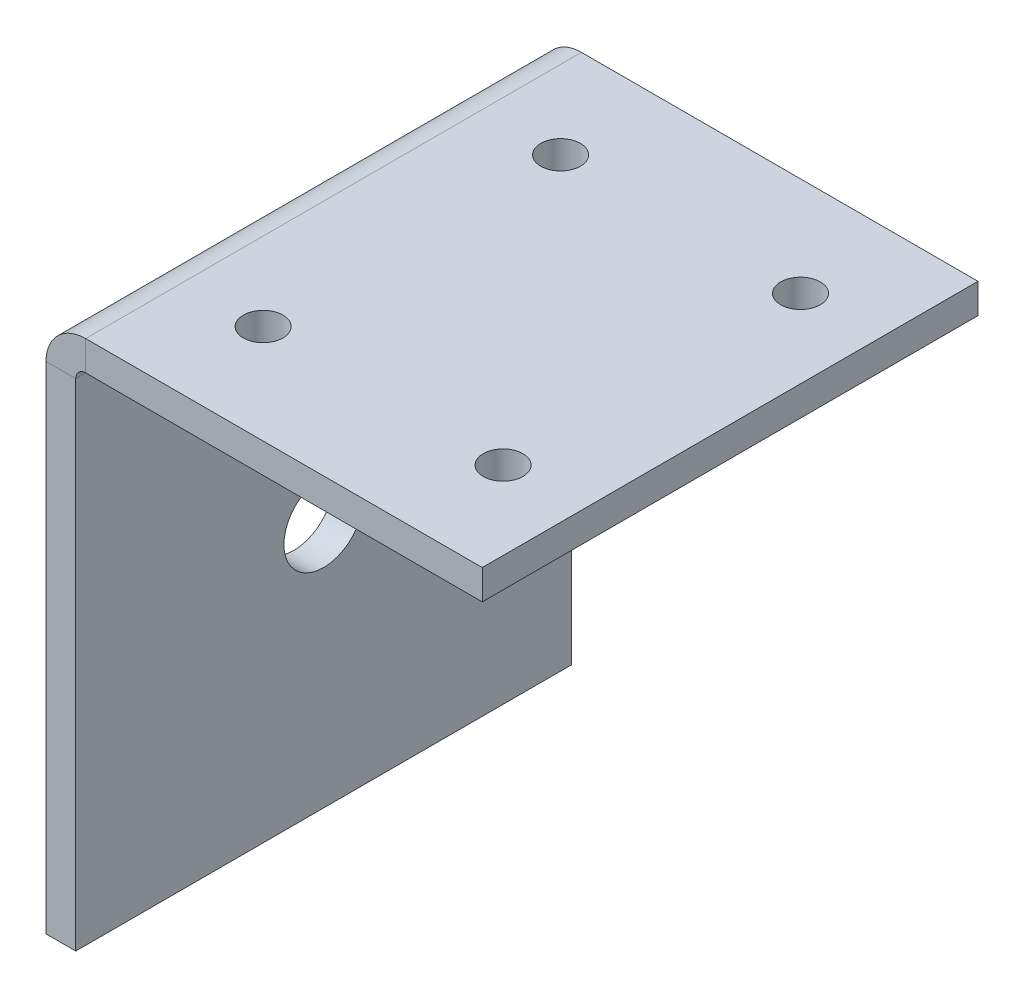
ISO-10303-21;
HEADER;
FILE_DESCRIPTION(('STEP AP214'),'2;1');
FILE_NAME('part.step','',(''),(''),'','','');
FILE_SCHEMA(('AUTOMOTIVE_DESIGN { 1 0 10303 214 1 1 1 1 }'));
ENDSEC;
DATA;
#1=APPLICATION_CONTEXT('core data for automotive mechanical design processes');
#2=APPLICATION_PROTOCOL_DEFINITION('international standard','automotive_design',2000,#1);
#3=PRODUCT_CONTEXT('',#1,'mechanical');
#4=PRODUCT('Part','Part','',(#3));
#5=PRODUCT_RELATED_PRODUCT_CATEGORY('part','',(#4));
#6=PRODUCT_DEFINITION_FORMATION('','',#4);
#7=PRODUCT_DEFINITION_CONTEXT('part definition',#1,'design');
#8=PRODUCT_DEFINITION('design','',#6,#7);
#9=PRODUCT_DEFINITION_SHAPE('','',#8);
#10=(LENGTH_UNIT() NAMED_UNIT(*) SI_UNIT(.MILLI.,.METRE.));
#11=(NAMED_UNIT(*) PLANE_ANGLE_UNIT() SI_UNIT($,.RADIAN.));
#12=(NAMED_UNIT(*) SI_UNIT($,.STERADIAN.) SOLID_ANGLE_UNIT());
#13=UNCERTAINTY_MEASURE_WITH_UNIT(LENGTH_MEASURE(1.E-05),#10,'distance_accuracy_value','');
#14=(GEOMETRIC_REPRESENTATION_CONTEXT(3) GLOBAL_UNCERTAINTY_ASSIGNED_CONTEXT((#13)) GLOBAL_UNIT_ASSIGNED_CONTEXT((#10,
#11,#12)) REPRESENTATION_CONTEXT('',''));
#15=CARTESIAN_POINT('',(0.,0.,0.));
#16=DIRECTION('',(0.,0.,1.));
#17=DIRECTION('',(1.,0.,0.));
#18=AXIS2_PLACEMENT_3D('',#15,#16,#17);
#19=CARTESIAN_POINT('',(-20.,-3.,-25.));
#20=DIRECTION('',(0.,0.,-1.));
#21=DIRECTION('',(-1.,0.,0.));
#22=AXIS2_PLACEMENT_3D('',#19,#20,#21);
#23=PLANE('',#22);
#24=DIRECTION('',(-1.,0.,0.));
#25=VECTOR('',#24,1.);
#26=CARTESIAN_POINT('',(-20.,0.,-25.));
#27=LINE('',#26,#25);
#28=CARTESIAN_POINT('',(20.,0.,-25.));
#29=VERTEX_POINT('',#28);
#30=CARTESIAN_POINT('',(-20.,0.,-25.));
#31=VERTEX_POINT('',#30);
#32=EDGE_CURVE('E108',#29,#31,#27,.T.);
#33=ORIENTED_EDGE('',*,*,#32,.F.);
#34=DIRECTION('',(0.,1.,0.));
#35=VECTOR('',#34,1.);
#36=CARTESIAN_POINT('',(20.,-3.,-25.));
#37=LINE('',#36,#35);
#38=CARTESIAN_POINT('',(20.,-3.,-25.));
#39=VERTEX_POINT('',#38);
#40=EDGE_CURVE('E71',#39,#29,#37,.T.);
#41=ORIENTED_EDGE('',*,*,#40,.F.);
#42=DIRECTION('',(-1.,0.,0.));
#43=VECTOR('',#42,1.);
#44=CARTESIAN_POINT('',(-20.,-3.,-25.));
#45=LINE('',#44,#43);
#46=CARTESIAN_POINT('',(-20.,-3.,-25.));
#47=VERTEX_POINT('',#46);
#48=EDGE_CURVE('E121',#39,#47,#45,.T.);
#49=ORIENTED_EDGE('',*,*,#48,.T.);
#50=DIRECTION('',(0.,1.,0.));
#51=VECTOR('',#50,1.);
#52=CARTESIAN_POINT('',(-20.,-3.,-25.));
#53=LINE('',#52,#51);
#54=EDGE_CURVE('E13',#47,#31,#53,.T.);
#55=ORIENTED_EDGE('',*,*,#54,.T.);
#56=EDGE_LOOP('',(#33,#41,#49,#55));
#57=FACE_BOUND('',#56,.T.);
#58=ADVANCED_FACE('F61',(#57),#23,.T.);
#59=CARTESIAN_POINT('',(20.,-3.,25.));
#60=DIRECTION('',(1.,0.,0.));
#61=DIRECTION('',(0.,0.,-1.));
#62=AXIS2_PLACEMENT_3D('',#59,#60,#61);
#63=PLANE('',#62);
#64=DIRECTION('',(0.,0.,-1.));
#65=VECTOR('',#64,1.);
#66=CARTESIAN_POINT('',(20.,0.,25.));
#67=LINE('',#66,#65);
#68=CARTESIAN_POINT('',(20.,0.,25.));
#69=VERTEX_POINT('',#68);
#70=EDGE_CURVE('E98',#69,#29,#67,.T.);
#71=ORIENTED_EDGE('',*,*,#70,.F.);
#72=DIRECTION('',(0.,1.,0.));
#73=VECTOR('',#72,1.);
#74=CARTESIAN_POINT('',(20.,-3.,25.));
#75=LINE('',#74,#73);
#76=CARTESIAN_POINT('',(20.,-3.,25.));
#77=VERTEX_POINT('',#76);
#78=EDGE_CURVE('E93',#77,#69,#75,.T.);
#79=ORIENTED_EDGE('',*,*,#78,.F.);
#80=DIRECTION('',(0.,0.,-1.));
#81=VECTOR('',#80,1.);
#82=CARTESIAN_POINT('',(20.,-3.,25.));
#83=LINE('',#82,#81);
#84=EDGE_CURVE('E101',#77,#39,#83,.T.);
#85=ORIENTED_EDGE('',*,*,#84,.T.);
#86=ORIENTED_EDGE('',*,*,#40,.T.);
#87=EDGE_LOOP('',(#71,#79,#85,#86));
#88=FACE_BOUND('',#87,.T.);
#89=ADVANCED_FACE('F97',(#88),#63,.T.);
#90=CARTESIAN_POINT('',(-20.,-3.,25.));
#91=DIRECTION('',(0.,0.,1.));
#92=DIRECTION('',(1.,0.,0.));
#93=AXIS2_PLACEMENT_3D('',#90,#91,#92);
#94=PLANE('',#93);
#95=DIRECTION('',(1.,0.,0.));
#96=VECTOR('',#95,1.);
#97=CARTESIAN_POINT('',(-20.,0.,25.));
#98=LINE('',#97,#96);
#99=CARTESIAN_POINT('',(-20.,0.,25.));
#100=VERTEX_POINT('',#99);
#101=EDGE_CURVE('E109',#100,#69,#98,.T.);
#102=ORIENTED_EDGE('',*,*,#101,.F.);
#103=DIRECTION('',(0.,1.,0.));
#104=VECTOR('',#103,1.);
#105=CARTESIAN_POINT('',(-20.,-3.,25.));
#106=LINE('',#105,#104);
#107=CARTESIAN_POINT('',(-20.,-3.,25.));
#108=VERTEX_POINT('',#107);
#109=EDGE_CURVE('E119',#108,#100,#106,.T.);
#110=ORIENTED_EDGE('',*,*,#109,.F.);
#111=DIRECTION('',(1.,0.,0.));
#112=VECTOR('',#111,1.);
#113=CARTESIAN_POINT('',(-20.,-3.,25.));
#114=LINE('',#113,#112);
#115=EDGE_CURVE('E115',#108,#77,#114,.T.);
#116=ORIENTED_EDGE('',*,*,#115,.T.);
#117=ORIENTED_EDGE('',*,*,#78,.T.);
#118=EDGE_LOOP('',(#102,#110,#116,#117));
#119=FACE_BOUND('',#118,.T.);
#120=ADVANCED_FACE('F63',(#119),#94,.T.);
#121=CARTESIAN_POINT('',(0.,-3.,0.));
#122=DIRECTION('',(0.,-1.,0.));
#123=DIRECTION('',(0.,0.,-1.));
#124=AXIS2_PLACEMENT_3D('',#121,#122,#123);
#125=PLANE('',#124);
#126=CARTESIAN_POINT('',(12.1,-3.,15.));
#127=DIRECTION('',(0.,1.,0.));
#128=DIRECTION('',(0.,0.,1.));
#129=AXIS2_PLACEMENT_3D('',#126,#127,#128);
#130=CIRCLE('',#129,2.);
#131=CARTESIAN_POINT('',(12.1,-3.,17.));
#132=VERTEX_POINT('',#131);
#133=EDGE_CURVE('E217',#132,#132,#130,.T.);
#134=ORIENTED_EDGE('',*,*,#133,.T.);
#135=EDGE_LOOP('',(#134));
#136=FACE_BOUND('',#135,.T.);
#137=CARTESIAN_POINT('',(-12.1,-3.,-15.));
#138=DIRECTION('',(0.,1.,0.));
#139=DIRECTION('',(0.,0.,1.));
#140=AXIS2_PLACEMENT_3D('',#137,#138,#139);
#141=CIRCLE('',#140,2.);
#142=CARTESIAN_POINT('',(-12.1,-3.,-13.));
#143=VERTEX_POINT('',#142);
#144=EDGE_CURVE('E223',#143,#143,#141,.T.);
#145=ORIENTED_EDGE('',*,*,#144,.T.);
#146=EDGE_LOOP('',(#145));
#147=FACE_BOUND('',#146,.T.);
#148=CARTESIAN_POINT('',(-12.1,-3.,15.));
#149=DIRECTION('',(0.,1.,0.));
#150=DIRECTION('',(0.,0.,1.));
#151=AXIS2_PLACEMENT_3D('',#148,#149,#150);
#152=CIRCLE('',#151,2.);
#153=CARTESIAN_POINT('',(-12.1,-3.,17.));
#154=VERTEX_POINT('',#153);
#155=EDGE_CURVE('E140',#154,#154,#152,.T.);
#156=ORIENTED_EDGE('',*,*,#155,.T.);
#157=EDGE_LOOP('',(#156));
#158=FACE_BOUND('',#157,.T.);
#159=CARTESIAN_POINT('',(12.1,-3.,-15.));
#160=DIRECTION('',(0.,1.,0.));
#161=DIRECTION('',(0.,0.,1.));
#162=AXIS2_PLACEMENT_3D('',#159,#160,#161);
#163=CIRCLE('',#162,2.);
#164=CARTESIAN_POINT('',(12.1,-3.,-13.));
#165=VERTEX_POINT('',#164);
#166=EDGE_CURVE('E132',#165,#165,#163,.T.);
#167=ORIENTED_EDGE('',*,*,#166,.T.);
#168=EDGE_LOOP('',(#167));
#169=FACE_BOUND('',#168,.T.);
#170=DIRECTION('',(0.,0.,1.));
#171=VECTOR('',#170,1.);
#172=CARTESIAN_POINT('',(-20.,-3.,25.));
#173=LINE('',#172,#171);
#174=EDGE_CURVE('E112',#47,#108,#173,.T.);
#175=ORIENTED_EDGE('',*,*,#174,.F.);
#176=ORIENTED_EDGE('',*,*,#48,.F.);
#177=ORIENTED_EDGE('',*,*,#84,.F.);
#178=ORIENTED_EDGE('',*,*,#115,.F.);
#179=EDGE_LOOP('',(#175,#176,#177,#178));
#180=FACE_BOUND('',#179,.T.);
#181=ADVANCED_FACE('F149',(#136,#147,#158,#169,#180),#125,.T.);
#182=CARTESIAN_POINT('',(0.,0.,0.));
#183=DIRECTION('',(0.,-1.,0.));
#184=DIRECTION('',(0.,0.,-1.));
#185=AXIS2_PLACEMENT_3D('',#182,#183,#184);
#186=PLANE('',#185);
#187=CARTESIAN_POINT('',(12.1,0.,15.));
#188=DIRECTION('',(0.,1.,0.));
#189=DIRECTION('',(0.,0.,1.));
#190=AXIS2_PLACEMENT_3D('',#187,#188,#189);
#191=CIRCLE('',#190,2.);
#192=CARTESIAN_POINT('',(12.1,0.,17.));
#193=VERTEX_POINT('',#192);
#194=EDGE_CURVE('E213',#193,#193,#191,.T.);
#195=ORIENTED_EDGE('',*,*,#194,.F.);
#196=EDGE_LOOP('',(#195));
#197=FACE_BOUND('',#196,.T.);
#198=CARTESIAN_POINT('',(-12.1,0.,-15.));
#199=DIRECTION('',(0.,1.,0.));
#200=DIRECTION('',(0.,0.,1.));
#201=AXIS2_PLACEMENT_3D('',#198,#199,#200);
#202=CIRCLE('',#201,2.);
#203=CARTESIAN_POINT('',(-12.1,0.,-13.));
#204=VERTEX_POINT('',#203);
#205=EDGE_CURVE('E220',#204,#204,#202,.T.);
#206=ORIENTED_EDGE('',*,*,#205,.F.);
#207=EDGE_LOOP('',(#206));
#208=FACE_BOUND('',#207,.T.);
#209=CARTESIAN_POINT('',(-12.1,0.,15.));
#210=DIRECTION('',(0.,1.,0.));
#211=DIRECTION('',(0.,0.,1.));
#212=AXIS2_PLACEMENT_3D('',#209,#210,#211);
#213=CIRCLE('',#212,2.);
#214=CARTESIAN_POINT('',(-12.1,0.,17.));
#215=VERTEX_POINT('',#214);
#216=EDGE_CURVE('E143',#215,#215,#213,.T.);
#217=ORIENTED_EDGE('',*,*,#216,.F.);
#218=EDGE_LOOP('',(#217));
#219=FACE_BOUND('',#218,.T.);
#220=CARTESIAN_POINT('',(12.1,0.,-15.));
#221=DIRECTION('',(0.,1.,0.));
#222=DIRECTION('',(0.,0.,1.));
#223=AXIS2_PLACEMENT_3D('',#220,#221,#222);
#224=CIRCLE('',#223,2.);
#225=CARTESIAN_POINT('',(12.1,0.,-13.));
#226=VERTEX_POINT('',#225);
#227=EDGE_CURVE('E135',#226,#226,#224,.T.);
#228=ORIENTED_EDGE('',*,*,#227,.F.);
#229=EDGE_LOOP('',(#228));
#230=FACE_BOUND('',#229,.T.);
#231=DIRECTION('',(0.,0.,1.));
#232=VECTOR('',#231,1.);
#233=CARTESIAN_POINT('',(-20.,0.,25.));
#234=LINE('',#233,#232);
#235=EDGE_CURVE('E131',#31,#100,#234,.T.);
#236=ORIENTED_EDGE('',*,*,#235,.T.);
#237=ORIENTED_EDGE('',*,*,#101,.T.);
#238=ORIENTED_EDGE('',*,*,#70,.T.);
#239=ORIENTED_EDGE('',*,*,#32,.T.);
#240=EDGE_LOOP('',(#236,#237,#238,#239));
#241=FACE_BOUND('',#240,.T.);
#242=ADVANCED_FACE('F107',(#197,#208,#219,#230,#241),#186,.F.);
#243=CARTESIAN_POINT('',(12.1,-3.,-15.));
#244=DIRECTION('',(0.,1.,0.));
#245=DIRECTION('',(0.,0.,1.));
#246=AXIS2_PLACEMENT_3D('',#243,#244,#245);
#247=CYLINDRICAL_SURFACE('',#246,2.);
#248=ORIENTED_EDGE('',*,*,#166,.F.);
#249=EDGE_LOOP('',(#248));
#250=FACE_BOUND('',#249,.T.);
#251=ORIENTED_EDGE('',*,*,#227,.T.);
#252=EDGE_LOOP('',(#251));
#253=FACE_BOUND('',#252,.T.);
#254=ADVANCED_FACE('F237',(#250,#253),#247,.F.);
#255=CARTESIAN_POINT('',(-12.1,-3.,15.));
#256=DIRECTION('',(0.,1.,0.));
#257=DIRECTION('',(0.,0.,1.));
#258=AXIS2_PLACEMENT_3D('',#255,#256,#257);
#259=CYLINDRICAL_SURFACE('',#258,2.);
#260=ORIENTED_EDGE('',*,*,#155,.F.);
#261=EDGE_LOOP('',(#260));
#262=FACE_BOUND('',#261,.T.);
#263=ORIENTED_EDGE('',*,*,#216,.T.);
#264=EDGE_LOOP('',(#263));
#265=FACE_BOUND('',#264,.T.);
#266=ADVANCED_FACE('F233',(#262,#265),#259,.F.);
#267=CARTESIAN_POINT('',(-12.1,-3.,-15.));
#268=DIRECTION('',(0.,1.,0.));
#269=DIRECTION('',(0.,0.,1.));
#270=AXIS2_PLACEMENT_3D('',#267,#268,#269);
#271=CYLINDRICAL_SURFACE('',#270,2.);
#272=ORIENTED_EDGE('',*,*,#144,.F.);
#273=EDGE_LOOP('',(#272));
#274=FACE_BOUND('',#273,.T.);
#275=ORIENTED_EDGE('',*,*,#205,.T.);
#276=EDGE_LOOP('',(#275));
#277=FACE_BOUND('',#276,.T.);
#278=ADVANCED_FACE('F248',(#274,#277),#271,.F.);
#279=CARTESIAN_POINT('',(12.1,-3.,15.));
#280=DIRECTION('',(0.,1.,0.));
#281=DIRECTION('',(0.,0.,1.));
#282=AXIS2_PLACEMENT_3D('',#279,#280,#281);
#283=CYLINDRICAL_SURFACE('',#282,2.);
#284=ORIENTED_EDGE('',*,*,#133,.F.);
#285=EDGE_LOOP('',(#284));
#286=FACE_BOUND('',#285,.T.);
#287=ORIENTED_EDGE('',*,*,#194,.T.);
#288=EDGE_LOOP('',(#287));
#289=FACE_BOUND('',#288,.T.);
#290=ADVANCED_FACE('F268',(#286,#289),#283,.F.);
#291=CARTESIAN_POINT('',(-20.,-4.,25.));
#292=DIRECTION('',(0.,0.,1.));
#293=DIRECTION('',(1.,0.,0.));
#294=AXIS2_PLACEMENT_3D('',#291,#292,#293);
#295=PLANE('',#294);
#296=DIRECTION('',(1.,0.,0.));
#297=VECTOR('',#296,1.);
#298=CARTESIAN_POINT('',(-24.,-3.99999999999999,25.));
#299=LINE('',#298,#297);
#300=CARTESIAN_POINT('',(-21.,-4.,25.));
#301=VERTEX_POINT('',#300);
#302=CARTESIAN_POINT('',(-24.,-3.99999999999999,25.));
#303=VERTEX_POINT('',#302);
#304=EDGE_CURVE('E176',#301,#303,#299,.F.);
#305=ORIENTED_EDGE('',*,*,#304,.F.);
#306=CARTESIAN_POINT('',(-20.,-4.,25.));
#307=DIRECTION('',(0.,0.,-1.));
#308=DIRECTION('',(-1.,0.,0.));
#309=AXIS2_PLACEMENT_3D('',#306,#307,#308);
#310=CIRCLE('',#309,1.);
#311=EDGE_CURVE('E170',#108,#301,#310,.F.);
#312=ORIENTED_EDGE('',*,*,#311,.F.);
#313=ORIENTED_EDGE('',*,*,#109,.T.);
#314=CARTESIAN_POINT('',(-20.,-4.,25.));
#315=DIRECTION('',(0.,0.,-1.));
#316=DIRECTION('',(-1.,0.,0.));
#317=AXIS2_PLACEMENT_3D('',#314,#315,#316);
#318=CIRCLE('',#317,4.);
#319=EDGE_CURVE('E211',#100,#303,#318,.F.);
#320=ORIENTED_EDGE('',*,*,#319,.T.);
#321=EDGE_LOOP('',(#305,#312,#313,#320));
#322=FACE_BOUND('',#321,.T.);
#323=ADVANCED_FACE('F275',(#322),#295,.T.);
#324=CARTESIAN_POINT('',(-20.,-4.,-25.));
#325=DIRECTION('',(0.,0.,1.));
#326=DIRECTION('',(1.,0.,0.));
#327=AXIS2_PLACEMENT_3D('',#324,#325,#326);
#328=PLANE('',#327);
#329=CARTESIAN_POINT('',(-20.,-4.,-25.));
#330=DIRECTION('',(0.,0.,-1.));
#331=DIRECTION('',(-1.,0.,0.));
#332=AXIS2_PLACEMENT_3D('',#329,#330,#331);
#333=CIRCLE('',#332,1.);
#334=CARTESIAN_POINT('',(-21.,-4.,-25.));
#335=VERTEX_POINT('',#334);
#336=EDGE_CURVE('E169',#335,#47,#333,.T.);
#337=ORIENTED_EDGE('',*,*,#336,.F.);
#338=DIRECTION('',(1.,0.,0.));
#339=VECTOR('',#338,1.);
#340=CARTESIAN_POINT('',(-21.,-4.,-25.));
#341=LINE('',#340,#339);
#342=CARTESIAN_POINT('',(-24.,-3.99999999999999,-25.));
#343=VERTEX_POINT('',#342);
#344=EDGE_CURVE('E175',#335,#343,#341,.F.);
#345=ORIENTED_EDGE('',*,*,#344,.T.);
#346=CARTESIAN_POINT('',(-20.,-4.,-25.));
#347=DIRECTION('',(0.,0.,-1.));
#348=DIRECTION('',(-1.,0.,0.));
#349=AXIS2_PLACEMENT_3D('',#346,#347,#348);
#350=CIRCLE('',#349,4.);
#351=EDGE_CURVE('E214',#343,#31,#350,.T.);
#352=ORIENTED_EDGE('',*,*,#351,.T.);
#353=ORIENTED_EDGE('',*,*,#54,.F.);
#354=EDGE_LOOP('',(#337,#345,#352,#353));
#355=FACE_BOUND('',#354,.T.);
#356=ADVANCED_FACE('F181',(#355),#328,.F.);
#357=CARTESIAN_POINT('',(-20.,-4.,-25.));
#358=DIRECTION('',(0.,0.,-1.));
#359=DIRECTION('',(-1.,0.,0.));
#360=AXIS2_PLACEMENT_3D('',#357,#358,#359);
#361=CYLINDRICAL_SURFACE('',#360,4.);
#362=ORIENTED_EDGE('',*,*,#235,.F.);
#363=ORIENTED_EDGE('',*,*,#351,.F.);
#364=DIRECTION('',(0.,0.,-1.));
#365=VECTOR('',#364,1.);
#366=CARTESIAN_POINT('',(-24.,-3.99999999999999,25.));
#367=LINE('',#366,#365);
#368=EDGE_CURVE('E197',#343,#303,#367,.F.);
#369=ORIENTED_EDGE('',*,*,#368,.T.);
#370=ORIENTED_EDGE('',*,*,#319,.F.);
#371=EDGE_LOOP('',(#362,#363,#369,#370));
#372=FACE_BOUND('',#371,.T.);
#373=ADVANCED_FACE('F281',(#372),#361,.T.);
#374=CARTESIAN_POINT('',(-20.,-4.,-25.));
#375=DIRECTION('',(0.,0.,-1.));
#376=DIRECTION('',(-1.,0.,0.));
#377=AXIS2_PLACEMENT_3D('',#374,#375,#376);
#378=CYLINDRICAL_SURFACE('',#377,1.);
#379=ORIENTED_EDGE('',*,*,#174,.T.);
#380=ORIENTED_EDGE('',*,*,#311,.T.);
#381=DIRECTION('',(0.,0.,-1.));
#382=VECTOR('',#381,1.);
#383=CARTESIAN_POINT('',(-21.,-4.,25.));
#384=LINE('',#383,#382);
#385=EDGE_CURVE('E166',#301,#335,#384,.T.);
#386=ORIENTED_EDGE('',*,*,#385,.T.);
#387=ORIENTED_EDGE('',*,*,#336,.T.);
#388=EDGE_LOOP('',(#379,#380,#386,#387));
#389=FACE_BOUND('',#388,.T.);
#390=ADVANCED_FACE('F168',(#389),#378,.F.);
#391=CARTESIAN_POINT('',(-24.0000000000002,-54.,-25.));
#392=DIRECTION('',(0.,0.,1.));
#393=DIRECTION('',(1.,0.,0.));
#394=AXIS2_PLACEMENT_3D('',#391,#392,#393);
#395=PLANE('',#394);
#396=ORIENTED_EDGE('',*,*,#344,.F.);
#397=DIRECTION('',(0.,1.,0.));
#398=VECTOR('',#397,1.);
#399=CARTESIAN_POINT('',(-21.0000000000002,-54.,-25.));
#400=LINE('',#399,#398);
#401=CARTESIAN_POINT('',(-21.0000000000002,-54.,-25.));
#402=VERTEX_POINT('',#401);
#403=EDGE_CURVE('E193',#335,#402,#400,.F.);
#404=ORIENTED_EDGE('',*,*,#403,.T.);
#405=DIRECTION('',(1.,0.,0.));
#406=VECTOR('',#405,1.);
#407=CARTESIAN_POINT('',(-24.0000000000002,-54.,-25.));
#408=LINE('',#407,#406);
#409=CARTESIAN_POINT('',(-24.0000000000002,-54.,-25.));
#410=VERTEX_POINT('',#409);
#411=EDGE_CURVE('E185',#410,#402,#408,.T.);
#412=ORIENTED_EDGE('',*,*,#411,.F.);
#413=DIRECTION('',(0.,-1.,0.));
#414=VECTOR('',#413,1.);
#415=CARTESIAN_POINT('',(-24.,0.,-25.));
#416=LINE('',#415,#414);
#417=EDGE_CURVE('E196',#343,#410,#416,.T.);
#418=ORIENTED_EDGE('',*,*,#417,.F.);
#419=EDGE_LOOP('',(#396,#404,#412,#418));
#420=FACE_BOUND('',#419,.T.);
#421=ADVANCED_FACE('F190',(#420),#395,.F.);
#422=CARTESIAN_POINT('',(-24.,-2.99999999999999,25.));
#423=DIRECTION('',(0.,0.,-1.));
#424=DIRECTION('',(-1.,0.,0.));
#425=AXIS2_PLACEMENT_3D('',#422,#423,#424);
#426=PLANE('',#425);
#427=ORIENTED_EDGE('',*,*,#304,.T.);
#428=DIRECTION('',(0.,1.,0.));
#429=VECTOR('',#428,1.);
#430=CARTESIAN_POINT('',(-24.,0.,25.));
#431=LINE('',#430,#429);
#432=CARTESIAN_POINT('',(-24.0000000000002,-54.,25.));
#433=VERTEX_POINT('',#432);
#434=EDGE_CURVE('E323',#433,#303,#431,.T.);
#435=ORIENTED_EDGE('',*,*,#434,.F.);
#436=DIRECTION('',(1.,0.,0.));
#437=VECTOR('',#436,1.);
#438=CARTESIAN_POINT('',(-24.0000000000002,-54.,25.));
#439=LINE('',#438,#437);
#440=CARTESIAN_POINT('',(-21.0000000000002,-54.,25.));
#441=VERTEX_POINT('',#440);
#442=EDGE_CURVE('E320',#433,#441,#439,.T.);
#443=ORIENTED_EDGE('',*,*,#442,.T.);
#444=DIRECTION('',(0.,-1.,0.));
#445=VECTOR('',#444,1.);
#446=CARTESIAN_POINT('',(-21.,-3.,25.));
#447=LINE('',#446,#445);
#448=EDGE_CURVE('E204',#441,#301,#447,.F.);
#449=ORIENTED_EDGE('',*,*,#448,.T.);
#450=EDGE_LOOP('',(#427,#435,#443,#449));
#451=FACE_BOUND('',#450,.T.);
#452=ADVANCED_FACE('F291',(#451),#426,.F.);
#453=CARTESIAN_POINT('',(-24.,0.,0.));
#454=DIRECTION('',(1.,0.,0.));
#455=DIRECTION('',(0.,1.,0.));
#456=AXIS2_PLACEMENT_3D('',#453,#454,#455);
#457=PLANE('',#456);
#458=CARTESIAN_POINT('',(-24.0000000000001,-29.,0.));
#459=DIRECTION('',(-1.,0.,0.));
#460=DIRECTION('',(0.,-1.,0.));
#461=AXIS2_PLACEMENT_3D('',#458,#459,#460);
#462=CIRCLE('',#461,4.);
#463=CARTESIAN_POINT('',(-24.0000000000001,-33.,0.));
#464=VERTEX_POINT('',#463);
#465=EDGE_CURVE('E316',#464,#464,#462,.T.);
#466=ORIENTED_EDGE('',*,*,#465,.F.);
#467=EDGE_LOOP('',(#466));
#468=FACE_BOUND('',#467,.T.);
#469=ORIENTED_EDGE('',*,*,#368,.F.);
#470=ORIENTED_EDGE('',*,*,#417,.T.);
#471=DIRECTION('',(0.,0.,1.));
#472=VECTOR('',#471,1.);
#473=CARTESIAN_POINT('',(-24.0000000000002,-54.,0.));
#474=LINE('',#473,#472);
#475=EDGE_CURVE('E326',#410,#433,#474,.T.);
#476=ORIENTED_EDGE('',*,*,#475,.T.);
#477=ORIENTED_EDGE('',*,*,#434,.T.);
#478=EDGE_LOOP('',(#469,#470,#476,#477));
#479=FACE_BOUND('',#478,.T.);
#480=ADVANCED_FACE('F299',(#468,#479),#457,.F.);
#481=CARTESIAN_POINT('',(-21.,0.,0.));
#482=DIRECTION('',(1.,0.,0.));
#483=DIRECTION('',(0.,1.,0.));
#484=AXIS2_PLACEMENT_3D('',#481,#482,#483);
#485=PLANE('',#484);
#486=CARTESIAN_POINT('',(-21.0000000000001,-29.,0.));
#487=DIRECTION('',(1.,0.,0.));
#488=DIRECTION('',(0.,1.,0.));
#489=AXIS2_PLACEMENT_3D('',#486,#487,#488);
#490=CIRCLE('',#489,4.);
#491=CARTESIAN_POINT('',(-21.0000000000001,-25.,0.));
#492=VERTEX_POINT('',#491);
#493=EDGE_CURVE('E65',#492,#492,#490,.T.);
#494=ORIENTED_EDGE('',*,*,#493,.F.);
#495=EDGE_LOOP('',(#494));
#496=FACE_BOUND('',#495,.T.);
#497=ORIENTED_EDGE('',*,*,#403,.F.);
#498=ORIENTED_EDGE('',*,*,#385,.F.);
#499=ORIENTED_EDGE('',*,*,#448,.F.);
#500=DIRECTION('',(0.,0.,-1.));
#501=VECTOR('',#500,1.);
#502=CARTESIAN_POINT('',(-21.0000000000002,-54.,25.));
#503=LINE('',#502,#501);
#504=EDGE_CURVE('E201',#402,#441,#503,.F.);
#505=ORIENTED_EDGE('',*,*,#504,.F.);
#506=EDGE_LOOP('',(#497,#498,#499,#505));
#507=FACE_BOUND('',#506,.T.);
#508=ADVANCED_FACE('F199',(#496,#507),#485,.T.);
#509=CARTESIAN_POINT('',(-24.0000000000002,-54.,25.));
#510=DIRECTION('',(0.,1.,0.));
#511=DIRECTION('',(-1.,0.,0.));
#512=AXIS2_PLACEMENT_3D('',#509,#510,#511);
#513=PLANE('',#512);
#514=ORIENTED_EDGE('',*,*,#504,.T.);
#515=ORIENTED_EDGE('',*,*,#442,.F.);
#516=ORIENTED_EDGE('',*,*,#475,.F.);
#517=ORIENTED_EDGE('',*,*,#411,.T.);
#518=EDGE_LOOP('',(#514,#515,#516,#517));
#519=FACE_BOUND('',#518,.T.);
#520=ADVANCED_FACE('F292',(#519),#513,.F.);
#521=CARTESIAN_POINT('',(20.0000000000001,-29.0000000000001,0.));
#522=DIRECTION('',(-1.,0.,0.));
#523=DIRECTION('',(0.,-1.,0.));
#524=AXIS2_PLACEMENT_3D('',#521,#522,#523);
#525=CYLINDRICAL_SURFACE('',#524,4.);
#526=ORIENTED_EDGE('',*,*,#493,.T.);
#527=EDGE_LOOP('',(#526));
#528=FACE_BOUND('',#527,.T.);
#529=ORIENTED_EDGE('',*,*,#465,.T.);
#530=EDGE_LOOP('',(#529));
#531=FACE_BOUND('',#530,.T.);
#532=ADVANCED_FACE('F295',(#528,#531),#525,.F.);
#533=CLOSED_SHELL('',(#58,#89,#120,#181,#242,#254,#266,#278,#290,#323,#356,#373,#390,#421,#452,
#480,#508,#520,#532));
#534=MANIFOLD_SOLID_BREP('B2',#533);
#535=ADVANCED_BREP_SHAPE_REPRESENTATION('',(#18,#534),#14);
#536=SHAPE_DEFINITION_REPRESENTATION(#9,#535);
ENDSEC;
END-ISO-10303-21;
